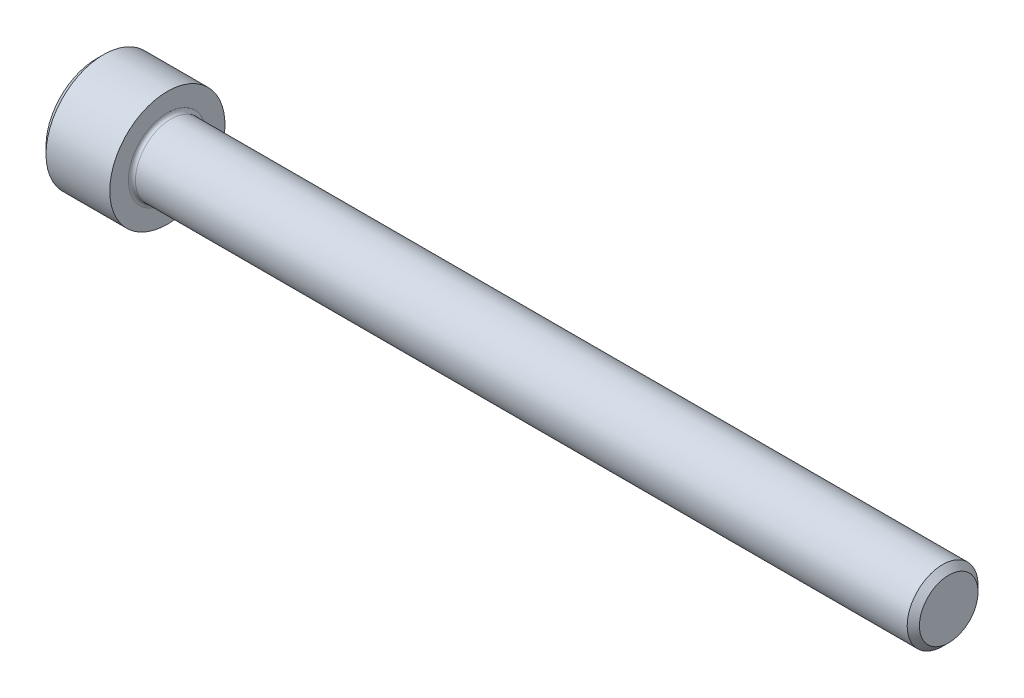
ISO-10303-21;
HEADER;
FILE_DESCRIPTION(('STEP AP214'),'2;1');
FILE_NAME('part.step','',(''),(''),'','','');
FILE_SCHEMA(('AUTOMOTIVE_DESIGN { 1 0 10303 214 1 1 1 1 }'));
ENDSEC;
DATA;
#1=APPLICATION_CONTEXT('core data for automotive mechanical design processes');
#2=APPLICATION_PROTOCOL_DEFINITION('international standard','automotive_design',2000,#1);
#3=PRODUCT_CONTEXT('',#1,'mechanical');
#4=PRODUCT('Part','Part','',(#3));
#5=PRODUCT_RELATED_PRODUCT_CATEGORY('part','',(#4));
#6=PRODUCT_DEFINITION_FORMATION('','',#4);
#7=PRODUCT_DEFINITION_CONTEXT('part definition',#1,'design');
#8=PRODUCT_DEFINITION('design','',#6,#7);
#9=PRODUCT_DEFINITION_SHAPE('','',#8);
#10=(LENGTH_UNIT() NAMED_UNIT(*) SI_UNIT(.MILLI.,.METRE.));
#11=(NAMED_UNIT(*) PLANE_ANGLE_UNIT() SI_UNIT($,.RADIAN.));
#12=(NAMED_UNIT(*) SI_UNIT($,.STERADIAN.) SOLID_ANGLE_UNIT());
#13=UNCERTAINTY_MEASURE_WITH_UNIT(LENGTH_MEASURE(1.E-05),#10,'distance_accuracy_value','');
#14=(GEOMETRIC_REPRESENTATION_CONTEXT(3) GLOBAL_UNCERTAINTY_ASSIGNED_CONTEXT((#13)) GLOBAL_UNIT_ASSIGNED_CONTEXT((#10,
#11,#12)) REPRESENTATION_CONTEXT('',''));
#15=CARTESIAN_POINT('',(0.,0.,0.));
#16=DIRECTION('',(0.,0.,1.));
#17=DIRECTION('',(1.,0.,0.));
#18=AXIS2_PLACEMENT_3D('',#15,#16,#17);
#19=CARTESIAN_POINT('',(0.,0.,0.));
#20=DIRECTION('',(-1.,0.,0.));
#21=DIRECTION('',(0.,0.,1.));
#22=AXIS2_PLACEMENT_3D('',#19,#20,#21);
#23=PLANE('',#22);
#24=DIRECTION('',(0.,-0.499999999999999,0.86602540378444));
#25=VECTOR('',#24,1.);
#26=CARTESIAN_POINT('',(0.,3.51894989071076,0.));
#27=LINE('',#26,#25);
#28=CARTESIAN_POINT('',(0.,3.51894989071076,0.));
#29=VERTEX_POINT('',#28);
#30=CARTESIAN_POINT('',(0.,1.75947494535539,3.0475));
#31=VERTEX_POINT('',#30);
#32=EDGE_CURVE('E387',#29,#31,#27,.T.);
#33=ORIENTED_EDGE('',*,*,#32,.T.);
#34=DIRECTION('',(0.,1.,0.));
#35=VECTOR('',#34,1.);
#36=CARTESIAN_POINT('',(0.,-1.75947494535538,3.0475));
#37=LINE('',#36,#35);
#38=CARTESIAN_POINT('',(0.,-1.75947494535538,3.0475));
#39=VERTEX_POINT('',#38);
#40=EDGE_CURVE('E131',#39,#31,#37,.T.);
#41=ORIENTED_EDGE('',*,*,#40,.F.);
#42=DIRECTION('',(0.,-0.500000000000001,-0.866025403784438));
#43=VECTOR('',#42,1.);
#44=CARTESIAN_POINT('',(0.,-1.75947494535538,3.0475));
#45=LINE('',#44,#43);
#46=CARTESIAN_POINT('',(0.,-3.51894989071077,0.));
#47=VERTEX_POINT('',#46);
#48=EDGE_CURVE('E390',#39,#47,#45,.T.);
#49=ORIENTED_EDGE('',*,*,#48,.T.);
#50=DIRECTION('',(0.,0.499999999999998,-0.86602540378444));
#51=VECTOR('',#50,1.);
#52=CARTESIAN_POINT('',(0.,-3.51894989071077,0.));
#53=LINE('',#52,#51);
#54=CARTESIAN_POINT('',(0.,-1.75947494535539,-3.0475));
#55=VERTEX_POINT('',#54);
#56=EDGE_CURVE('E393',#47,#55,#53,.T.);
#57=ORIENTED_EDGE('',*,*,#56,.T.);
#58=DIRECTION('',(0.,-1.,0.));
#59=VECTOR('',#58,1.);
#60=CARTESIAN_POINT('',(0.,1.75947494535538,-3.0475));
#61=LINE('',#60,#59);
#62=CARTESIAN_POINT('',(0.,1.75947494535538,-3.0475));
#63=VERTEX_POINT('',#62);
#64=EDGE_CURVE('E396',#63,#55,#61,.T.);
#65=ORIENTED_EDGE('',*,*,#64,.F.);
#66=DIRECTION('',(0.,-0.500000000000001,-0.866025403784438));
#67=VECTOR('',#66,1.);
#68=CARTESIAN_POINT('',(0.,3.51894989071076,0.));
#69=LINE('',#68,#67);
#70=EDGE_CURVE('E126',#29,#63,#69,.T.);
#71=ORIENTED_EDGE('',*,*,#70,.F.);
#72=EDGE_LOOP('',(#33,#41,#49,#57,#65,#71));
#73=FACE_BOUND('',#72,.T.);
#74=CARTESIAN_POINT('',(0.,0.,0.));
#75=DIRECTION('',(-1.,0.,0.));
#76=DIRECTION('',(0.,0.,1.));
#77=AXIS2_PLACEMENT_3D('',#74,#75,#76);
#78=CIRCLE('',#77,5.7);
#79=CARTESIAN_POINT('',(0.,0.,5.7));
#80=VERTEX_POINT('',#79);
#81=EDGE_CURVE('E142',#80,#80,#78,.T.);
#82=ORIENTED_EDGE('',*,*,#81,.T.);
#83=EDGE_LOOP('',(#82));
#84=FACE_BOUND('',#83,.T.);
#85=ADVANCED_FACE('F35',(#73,#84),#23,.T.);
#86=CARTESIAN_POINT('',(96.2,3.3095,0.));
#87=DIRECTION('',(1.,0.,0.));
#88=DIRECTION('',(0.,0.,-1.));
#89=AXIS2_PLACEMENT_3D('',#86,#87,#88);
#90=PLANE('',#89);
#91=CARTESIAN_POINT('',(96.2,0.,0.));
#92=DIRECTION('',(-1.,0.,0.));
#93=DIRECTION('',(0.,0.,1.));
#94=AXIS2_PLACEMENT_3D('',#91,#92,#93);
#95=CIRCLE('',#94,3.3095);
#96=CARTESIAN_POINT('',(96.2,0.,3.3095));
#97=VERTEX_POINT('',#96);
#98=EDGE_CURVE('E155',#97,#97,#95,.T.);
#99=ORIENTED_EDGE('',*,*,#98,.F.);
#100=EDGE_LOOP('',(#99));
#101=FACE_BOUND('',#100,.T.);
#102=ADVANCED_FACE('F176',(#101),#90,.T.);
#103=CARTESIAN_POINT('',(96.2,0.,0.));
#104=DIRECTION('',(-1.,0.,0.));
#105=DIRECTION('',(0.,0.,1.));
#106=AXIS2_PLACEMENT_3D('',#103,#104,#105);
#107=CONICAL_SURFACE('',#106,3.3095,0.785398163397296);
#108=CARTESIAN_POINT('',(95.5094999999999,0.,0.));
#109=DIRECTION('',(-1.,0.,0.));
#110=DIRECTION('',(0.,0.,1.));
#111=AXIS2_PLACEMENT_3D('',#108,#109,#110);
#112=CIRCLE('',#111,3.99999999999988);
#113=CARTESIAN_POINT('',(95.5094999999999,0.,3.99999999999988));
#114=VERTEX_POINT('',#113);
#115=EDGE_CURVE('E152',#114,#114,#112,.T.);
#116=ORIENTED_EDGE('',*,*,#115,.F.);
#117=EDGE_LOOP('',(#116));
#118=FACE_BOUND('',#117,.T.);
#119=ORIENTED_EDGE('',*,*,#98,.T.);
#120=EDGE_LOOP('',(#119));
#121=FACE_BOUND('',#120,.T.);
#122=ADVANCED_FACE('F182',(#118,#121),#107,.T.);
#123=CARTESIAN_POINT('',(-31.75,0.,0.));
#124=DIRECTION('',(-1.,0.,0.));
#125=DIRECTION('',(0.,0.,1.));
#126=AXIS2_PLACEMENT_3D('',#123,#124,#125);
#127=CYLINDRICAL_SURFACE('',#126,3.99999999999994);
#128=CARTESIAN_POINT('',(8.4,0.,0.));
#129=DIRECTION('',(1.,0.,0.));
#130=DIRECTION('',(0.,0.,-1.));
#131=AXIS2_PLACEMENT_3D('',#128,#129,#130);
#132=CIRCLE('',#131,3.99999999999994);
#133=CARTESIAN_POINT('',(8.4,0.,-3.99999999999994));
#134=VERTEX_POINT('',#133);
#135=EDGE_CURVE('E11',#134,#134,#132,.T.);
#136=ORIENTED_EDGE('',*,*,#135,.T.);
#137=EDGE_LOOP('',(#136));
#138=FACE_BOUND('',#137,.T.);
#139=ORIENTED_EDGE('',*,*,#115,.T.);
#140=EDGE_LOOP('',(#139));
#141=FACE_BOUND('',#140,.T.);
#142=ADVANCED_FACE('F193',(#138,#141),#127,.T.);
#143=CARTESIAN_POINT('',(8.,6.5,0.));
#144=DIRECTION('',(1.,0.,0.));
#145=DIRECTION('',(0.,0.,-1.));
#146=AXIS2_PLACEMENT_3D('',#143,#144,#145);
#147=PLANE('',#146);
#148=CARTESIAN_POINT('',(8.,0.,0.));
#149=DIRECTION('',(1.,0.,0.));
#150=DIRECTION('',(0.,0.,-1.));
#151=AXIS2_PLACEMENT_3D('',#148,#149,#150);
#152=CIRCLE('',#151,4.39999999999994);
#153=CARTESIAN_POINT('',(8.,0.,-4.39999999999994));
#154=VERTEX_POINT('',#153);
#155=EDGE_CURVE('E43',#154,#154,#152,.F.);
#156=ORIENTED_EDGE('',*,*,#155,.T.);
#157=EDGE_LOOP('',(#156));
#158=FACE_BOUND('',#157,.T.);
#159=CARTESIAN_POINT('',(8.,0.,0.));
#160=DIRECTION('',(-1.,0.,0.));
#161=DIRECTION('',(0.,0.,1.));
#162=AXIS2_PLACEMENT_3D('',#159,#160,#161);
#163=CIRCLE('',#162,6.5);
#164=CARTESIAN_POINT('',(8.,0.,6.5));
#165=VERTEX_POINT('',#164);
#166=EDGE_CURVE('E149',#165,#165,#163,.T.);
#167=ORIENTED_EDGE('',*,*,#166,.F.);
#168=EDGE_LOOP('',(#167));
#169=FACE_BOUND('',#168,.T.);
#170=ADVANCED_FACE('F160',(#158,#169),#147,.T.);
#171=CARTESIAN_POINT('',(-31.75,0.,0.));
#172=DIRECTION('',(-1.,0.,0.));
#173=DIRECTION('',(0.,0.,1.));
#174=AXIS2_PLACEMENT_3D('',#171,#172,#173);
#175=CYLINDRICAL_SURFACE('',#174,6.5);
#176=ORIENTED_EDGE('',*,*,#166,.T.);
#177=EDGE_LOOP('',(#176));
#178=FACE_BOUND('',#177,.T.);
#179=CARTESIAN_POINT('',(0.800000000000002,0.,0.));
#180=DIRECTION('',(-1.,0.,0.));
#181=DIRECTION('',(0.,0.,1.));
#182=AXIS2_PLACEMENT_3D('',#179,#180,#181);
#183=CIRCLE('',#182,6.5);
#184=CARTESIAN_POINT('',(0.800000000000002,0.,6.5));
#185=VERTEX_POINT('',#184);
#186=EDGE_CURVE('E146',#185,#185,#183,.T.);
#187=ORIENTED_EDGE('',*,*,#186,.F.);
#188=EDGE_LOOP('',(#187));
#189=FACE_BOUND('',#188,.T.);
#190=ADVANCED_FACE('F171',(#178,#189),#175,.T.);
#191=CARTESIAN_POINT('',(0.,0.,0.));
#192=DIRECTION('',(1.,0.,0.));
#193=DIRECTION('',(0.,0.,-1.));
#194=AXIS2_PLACEMENT_3D('',#191,#192,#193);
#195=CONICAL_SURFACE('',#194,5.7,0.785398163397447);
#196=ORIENTED_EDGE('',*,*,#186,.T.);
#197=EDGE_LOOP('',(#196));
#198=FACE_BOUND('',#197,.T.);
#199=ORIENTED_EDGE('',*,*,#81,.F.);
#200=EDGE_LOOP('',(#199));
#201=FACE_BOUND('',#200,.T.);
#202=ADVANCED_FACE('F164',(#198,#201),#195,.T.);
#203=CARTESIAN_POINT('',(8.4,0.,0.));
#204=DIRECTION('',(1.,0.,0.));
#205=DIRECTION('',(0.,0.,-1.));
#206=AXIS2_PLACEMENT_3D('',#203,#204,#205);
#207=TOROIDAL_SURFACE('',#206,4.39999999999994,0.4);
#208=ORIENTED_EDGE('',*,*,#135,.F.);
#209=EDGE_LOOP('',(#208));
#210=FACE_BOUND('',#209,.T.);
#211=ORIENTED_EDGE('',*,*,#155,.F.);
#212=EDGE_LOOP('',(#211));
#213=FACE_BOUND('',#212,.T.);
#214=ADVANCED_FACE('F37',(#210,#213),#207,.F.);
#215=CARTESIAN_POINT('',(4.,3.51894989071076,0.));
#216=DIRECTION('',(0.,-0.86602540378444,-0.499999999999999));
#217=DIRECTION('',(0.,0.499999999999999,-0.86602540378444));
#218=AXIS2_PLACEMENT_3D('',#215,#216,#217);
#219=PLANE('',#218);
#220=ORIENTED_EDGE('',*,*,#32,.F.);
#221=DIRECTION('',(-1.,0.,0.));
#222=VECTOR('',#221,1.);
#223=CARTESIAN_POINT('',(4.,3.51894989071076,0.));
#224=LINE('',#223,#222);
#225=CARTESIAN_POINT('',(4.,3.51894989071076,0.));
#226=VERTEX_POINT('',#225);
#227=EDGE_CURVE('E377',#226,#29,#224,.T.);
#228=ORIENTED_EDGE('',*,*,#227,.F.);
#229=DIRECTION('',(0.,-0.499999999999999,0.86602540378444));
#230=VECTOR('',#229,1.);
#231=CARTESIAN_POINT('',(4.,3.51894989071076,0.));
#232=LINE('',#231,#230);
#233=CARTESIAN_POINT('',(4.,2.63921241803308,1.52374999999999));
#234=VERTEX_POINT('',#233);
#235=EDGE_CURVE('E118',#226,#234,#232,.T.);
#236=ORIENTED_EDGE('',*,*,#235,.T.);
#237=CARTESIAN_POINT('',(4.,1.75947494535539,3.0475));
#238=VERTEX_POINT('',#237);
#239=EDGE_CURVE('E109',#234,#238,#232,.T.);
#240=ORIENTED_EDGE('',*,*,#239,.T.);
#241=DIRECTION('',(-1.,0.,0.));
#242=VECTOR('',#241,1.);
#243=CARTESIAN_POINT('',(4.,1.75947494535539,3.0475));
#244=LINE('',#243,#242);
#245=EDGE_CURVE('E123',#238,#31,#244,.T.);
#246=ORIENTED_EDGE('',*,*,#245,.T.);
#247=EDGE_LOOP('',(#220,#228,#236,#240,#246));
#248=FACE_BOUND('',#247,.T.);
#249=ADVANCED_FACE('F122',(#248),#219,.T.);
#250=CARTESIAN_POINT('',(4.,-1.75947494535538,3.0475));
#251=DIRECTION('',(0.,0.,1.));
#252=DIRECTION('',(0.,-1.,0.));
#253=AXIS2_PLACEMENT_3D('',#250,#251,#252);
#254=PLANE('',#253);
#255=ORIENTED_EDGE('',*,*,#40,.T.);
#256=ORIENTED_EDGE('',*,*,#245,.F.);
#257=DIRECTION('',(0.,1.,0.));
#258=VECTOR('',#257,1.);
#259=CARTESIAN_POINT('',(4.,-1.75947494535538,3.0475));
#260=LINE('',#259,#258);
#261=CARTESIAN_POINT('',(4.,0.,3.0475));
#262=VERTEX_POINT('',#261);
#263=EDGE_CURVE('E106',#262,#238,#260,.T.);
#264=ORIENTED_EDGE('',*,*,#263,.F.);
#265=CARTESIAN_POINT('',(4.,-1.75947494535538,3.0475));
#266=VERTEX_POINT('',#265);
#267=EDGE_CURVE('E117',#266,#262,#260,.T.);
#268=ORIENTED_EDGE('',*,*,#267,.F.);
#269=DIRECTION('',(-1.,0.,0.));
#270=VECTOR('',#269,1.);
#271=CARTESIAN_POINT('',(4.,-1.75947494535538,3.0475));
#272=LINE('',#271,#270);
#273=EDGE_CURVE('E133',#266,#39,#272,.T.);
#274=ORIENTED_EDGE('',*,*,#273,.T.);
#275=EDGE_LOOP('',(#255,#256,#264,#268,#274));
#276=FACE_BOUND('',#275,.T.);
#277=ADVANCED_FACE('F128',(#276),#254,.F.);
#278=CARTESIAN_POINT('',(4.,-1.75947494535538,3.0475));
#279=DIRECTION('',(0.,0.866025403784438,-0.500000000000001));
#280=DIRECTION('',(0.,0.500000000000001,0.866025403784438));
#281=AXIS2_PLACEMENT_3D('',#278,#279,#280);
#282=PLANE('',#281);
#283=ORIENTED_EDGE('',*,*,#48,.F.);
#284=ORIENTED_EDGE('',*,*,#273,.F.);
#285=DIRECTION('',(0.,-0.500000000000001,-0.866025403784438));
#286=VECTOR('',#285,1.);
#287=CARTESIAN_POINT('',(4.,-1.75947494535538,3.0475));
#288=LINE('',#287,#286);
#289=CARTESIAN_POINT('',(4.,-2.63921241803308,1.52375));
#290=VERTEX_POINT('',#289);
#291=EDGE_CURVE('E416',#266,#290,#288,.T.);
#292=ORIENTED_EDGE('',*,*,#291,.T.);
#293=CARTESIAN_POINT('',(4.,-3.51894989071077,0.));
#294=VERTEX_POINT('',#293);
#295=EDGE_CURVE('E405',#290,#294,#288,.T.);
#296=ORIENTED_EDGE('',*,*,#295,.T.);
#297=DIRECTION('',(-1.,0.,0.));
#298=VECTOR('',#297,1.);
#299=CARTESIAN_POINT('',(4.,-3.51894989071077,0.));
#300=LINE('',#299,#298);
#301=EDGE_CURVE('E138',#294,#47,#300,.T.);
#302=ORIENTED_EDGE('',*,*,#301,.T.);
#303=EDGE_LOOP('',(#283,#284,#292,#296,#302));
#304=FACE_BOUND('',#303,.T.);
#305=ADVANCED_FACE('F268',(#304),#282,.T.);
#306=CARTESIAN_POINT('',(4.,-3.51894989071077,0.));
#307=DIRECTION('',(0.,0.86602540378444,0.499999999999999));
#308=DIRECTION('',(0.,-0.499999999999999,0.86602540378444));
#309=AXIS2_PLACEMENT_3D('',#306,#307,#308);
#310=PLANE('',#309);
#311=ORIENTED_EDGE('',*,*,#56,.F.);
#312=ORIENTED_EDGE('',*,*,#301,.F.);
#313=DIRECTION('',(0.,0.499999999999998,-0.86602540378444));
#314=VECTOR('',#313,1.);
#315=CARTESIAN_POINT('',(4.,-3.51894989071077,0.));
#316=LINE('',#315,#314);
#317=CARTESIAN_POINT('',(4.,-2.63921241803308,-1.52375));
#318=VERTEX_POINT('',#317);
#319=EDGE_CURVE('E383',#294,#318,#316,.T.);
#320=ORIENTED_EDGE('',*,*,#319,.T.);
#321=CARTESIAN_POINT('',(4.,-1.75947494535539,-3.0475));
#322=VERTEX_POINT('',#321);
#323=EDGE_CURVE('E415',#318,#322,#316,.T.);
#324=ORIENTED_EDGE('',*,*,#323,.T.);
#325=DIRECTION('',(-1.,0.,0.));
#326=VECTOR('',#325,1.);
#327=CARTESIAN_POINT('',(4.,-1.75947494535539,-3.0475));
#328=LINE('',#327,#326);
#329=EDGE_CURVE('E376',#322,#55,#328,.T.);
#330=ORIENTED_EDGE('',*,*,#329,.T.);
#331=EDGE_LOOP('',(#311,#312,#320,#324,#330));
#332=FACE_BOUND('',#331,.T.);
#333=ADVANCED_FACE('F276',(#332),#310,.T.);
#334=CARTESIAN_POINT('',(4.,1.75947494535538,-3.0475));
#335=DIRECTION('',(0.,0.,-1.));
#336=DIRECTION('',(0.,1.,0.));
#337=AXIS2_PLACEMENT_3D('',#334,#335,#336);
#338=PLANE('',#337);
#339=ORIENTED_EDGE('',*,*,#64,.T.);
#340=ORIENTED_EDGE('',*,*,#329,.F.);
#341=DIRECTION('',(0.,-1.,0.));
#342=VECTOR('',#341,1.);
#343=CARTESIAN_POINT('',(4.,1.75947494535538,-3.0475));
#344=LINE('',#343,#342);
#345=CARTESIAN_POINT('',(4.,0.,-3.0475));
#346=VERTEX_POINT('',#345);
#347=EDGE_CURVE('E380',#346,#322,#344,.T.);
#348=ORIENTED_EDGE('',*,*,#347,.F.);
#349=CARTESIAN_POINT('',(4.,1.75947494535538,-3.0475));
#350=VERTEX_POINT('',#349);
#351=EDGE_CURVE('E50',#350,#346,#344,.T.);
#352=ORIENTED_EDGE('',*,*,#351,.F.);
#353=DIRECTION('',(-1.,0.,0.));
#354=VECTOR('',#353,1.);
#355=CARTESIAN_POINT('',(4.,1.75947494535538,-3.0475));
#356=LINE('',#355,#354);
#357=EDGE_CURVE('E373',#350,#63,#356,.T.);
#358=ORIENTED_EDGE('',*,*,#357,.T.);
#359=EDGE_LOOP('',(#339,#340,#348,#352,#358));
#360=FACE_BOUND('',#359,.T.);
#361=ADVANCED_FACE('F285',(#360),#338,.F.);
#362=CARTESIAN_POINT('',(4.,3.51894989071076,0.));
#363=DIRECTION('',(0.,0.866025403784438,-0.500000000000001));
#364=DIRECTION('',(0.,0.500000000000001,0.866025403784438));
#365=AXIS2_PLACEMENT_3D('',#362,#363,#364);
#366=PLANE('',#365);
#367=ORIENTED_EDGE('',*,*,#70,.T.);
#368=ORIENTED_EDGE('',*,*,#357,.F.);
#369=DIRECTION('',(0.,-0.500000000000001,-0.866025403784438));
#370=VECTOR('',#369,1.);
#371=CARTESIAN_POINT('',(4.,3.51894989071076,0.));
#372=LINE('',#371,#370);
#373=CARTESIAN_POINT('',(4.,2.63921241803307,-1.52375));
#374=VERTEX_POINT('',#373);
#375=EDGE_CURVE('E363',#374,#350,#372,.T.);
#376=ORIENTED_EDGE('',*,*,#375,.F.);
#377=EDGE_CURVE('E369',#226,#374,#372,.T.);
#378=ORIENTED_EDGE('',*,*,#377,.F.);
#379=ORIENTED_EDGE('',*,*,#227,.T.);
#380=EDGE_LOOP('',(#367,#368,#376,#378,#379));
#381=FACE_BOUND('',#380,.T.);
#382=ADVANCED_FACE('F294',(#381),#366,.F.);
#383=CARTESIAN_POINT('',(4.,5.27842483606614,-3.04750000000001));
#384=DIRECTION('',(1.,0.,0.));
#385=DIRECTION('',(0.,0.,-1.));
#386=AXIS2_PLACEMENT_3D('',#383,#384,#385);
#387=PLANE('',#386);
#388=ORIENTED_EDGE('',*,*,#347,.T.);
#389=ORIENTED_EDGE('',*,*,#323,.F.);
#390=CARTESIAN_POINT('',(4.,0.,0.));
#391=DIRECTION('',(-1.,0.,0.));
#392=DIRECTION('',(0.,0.,1.));
#393=AXIS2_PLACEMENT_3D('',#390,#391,#392);
#394=CIRCLE('',#393,3.0475);
#395=EDGE_CURVE('E411',#346,#318,#394,.T.);
#396=ORIENTED_EDGE('',*,*,#395,.F.);
#397=EDGE_LOOP('',(#388,#389,#396));
#398=FACE_BOUND('',#397,.T.);
#399=ADVANCED_FACE('F303',(#398),#387,.F.);
#400=ORIENTED_EDGE('',*,*,#319,.F.);
#401=ORIENTED_EDGE('',*,*,#295,.F.);
#402=EDGE_CURVE('E136',#318,#290,#394,.T.);
#403=ORIENTED_EDGE('',*,*,#402,.F.);
#404=EDGE_LOOP('',(#400,#401,#403));
#405=FACE_BOUND('',#404,.T.);
#406=ADVANCED_FACE('F312',(#405),#387,.F.);
#407=ORIENTED_EDGE('',*,*,#291,.F.);
#408=ORIENTED_EDGE('',*,*,#267,.T.);
#409=EDGE_CURVE('E132',#290,#262,#394,.T.);
#410=ORIENTED_EDGE('',*,*,#409,.F.);
#411=EDGE_LOOP('',(#407,#408,#410));
#412=FACE_BOUND('',#411,.T.);
#413=ADVANCED_FACE('F321',(#412),#387,.F.);
#414=ORIENTED_EDGE('',*,*,#263,.T.);
#415=ORIENTED_EDGE('',*,*,#239,.F.);
#416=EDGE_CURVE('E112',#262,#234,#394,.T.);
#417=ORIENTED_EDGE('',*,*,#416,.F.);
#418=EDGE_LOOP('',(#414,#415,#417));
#419=FACE_BOUND('',#418,.T.);
#420=ADVANCED_FACE('F108',(#419),#387,.F.);
#421=ORIENTED_EDGE('',*,*,#235,.F.);
#422=ORIENTED_EDGE('',*,*,#377,.T.);
#423=EDGE_CURVE('E143',#234,#374,#394,.T.);
#424=ORIENTED_EDGE('',*,*,#423,.F.);
#425=EDGE_LOOP('',(#421,#422,#424));
#426=FACE_BOUND('',#425,.T.);
#427=ADVANCED_FACE('F336',(#426),#387,.F.);
#428=ORIENTED_EDGE('',*,*,#375,.T.);
#429=ORIENTED_EDGE('',*,*,#351,.T.);
#430=EDGE_CURVE('E366',#374,#346,#394,.T.);
#431=ORIENTED_EDGE('',*,*,#430,.F.);
#432=EDGE_LOOP('',(#428,#429,#431));
#433=FACE_BOUND('',#432,.T.);
#434=ADVANCED_FACE('F251',(#433),#387,.F.);
#435=CARTESIAN_POINT('',(4.,0.,0.));
#436=DIRECTION('',(-1.,0.,0.));
#437=DIRECTION('',(0.,0.,1.));
#438=AXIS2_PLACEMENT_3D('',#435,#436,#437);
#439=CONICAL_SURFACE('',#438,3.0475,1.04719755119659);
#440=CARTESIAN_POINT('',(5.75947494535541,0.,0.));
#441=VERTEX_POINT('',#440);
#442=VERTEX_LOOP('',#441);
#443=FACE_BOUND('',#442,.T.);
#444=ORIENTED_EDGE('',*,*,#416,.T.);
#445=ORIENTED_EDGE('',*,*,#423,.T.);
#446=ORIENTED_EDGE('',*,*,#430,.T.);
#447=ORIENTED_EDGE('',*,*,#395,.T.);
#448=ORIENTED_EDGE('',*,*,#402,.T.);
#449=ORIENTED_EDGE('',*,*,#409,.T.);
#450=EDGE_LOOP('',(#444,#445,#446,#447,#448,#449));
#451=FACE_BOUND('',#450,.T.);
#452=ADVANCED_FACE('F186',(#443,#451),#439,.F.);
#453=CLOSED_SHELL('',(#85,#102,#122,#142,#170,#190,#202,#214,#249,#277,#305,#333,#361,#382,#399,
#406,#413,#420,#427,#434,#452));
#454=MANIFOLD_SOLID_BREP('B2',#453);
#455=ADVANCED_BREP_SHAPE_REPRESENTATION('',(#18,#454),#14);
#456=SHAPE_DEFINITION_REPRESENTATION(#9,#455);
ENDSEC;
END-ISO-10303-21;
